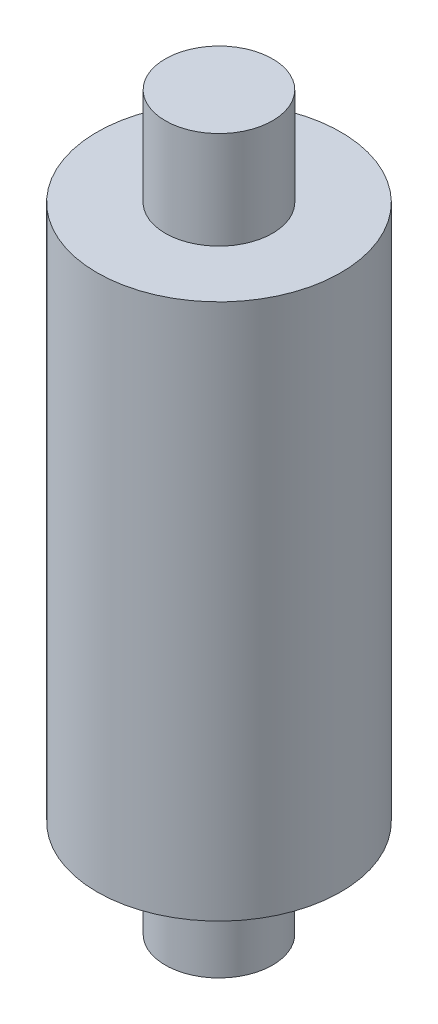
ISO-10303-21;
HEADER;
FILE_DESCRIPTION(('STEP AP214'),'2;1');
FILE_NAME('part.step','',(''),(''),'','','');
FILE_SCHEMA(('AUTOMOTIVE_DESIGN { 1 0 10303 214 1 1 1 1 }'));
ENDSEC;
DATA;
#1=APPLICATION_CONTEXT('core data for automotive mechanical design processes');
#2=APPLICATION_PROTOCOL_DEFINITION('international standard','automotive_design',2000,#1);
#3=PRODUCT_CONTEXT('',#1,'mechanical');
#4=PRODUCT('Part','Part','',(#3));
#5=PRODUCT_RELATED_PRODUCT_CATEGORY('part','',(#4));
#6=PRODUCT_DEFINITION_FORMATION('','',#4);
#7=PRODUCT_DEFINITION_CONTEXT('part definition',#1,'design');
#8=PRODUCT_DEFINITION('design','',#6,#7);
#9=PRODUCT_DEFINITION_SHAPE('','',#8);
#10=(LENGTH_UNIT() NAMED_UNIT(*) SI_UNIT(.MILLI.,.METRE.));
#11=(NAMED_UNIT(*) PLANE_ANGLE_UNIT() SI_UNIT($,.RADIAN.));
#12=(NAMED_UNIT(*) SI_UNIT($,.STERADIAN.) SOLID_ANGLE_UNIT());
#13=UNCERTAINTY_MEASURE_WITH_UNIT(LENGTH_MEASURE(1.E-05),#10,'distance_accuracy_value','');
#14=(GEOMETRIC_REPRESENTATION_CONTEXT(3) GLOBAL_UNCERTAINTY_ASSIGNED_CONTEXT((#13)) GLOBAL_UNIT_ASSIGNED_CONTEXT((#10,
#11,#12)) REPRESENTATION_CONTEXT('',''));
#15=CARTESIAN_POINT('',(0.,0.,0.));
#16=DIRECTION('',(0.,0.,1.));
#17=DIRECTION('',(1.,0.,0.));
#18=AXIS2_PLACEMENT_3D('',#15,#16,#17);
#19=CARTESIAN_POINT('',(0.,11.,0.));
#20=DIRECTION('',(0.,-1.,0.));
#21=DIRECTION('',(0.,0.,-1.));
#22=AXIS2_PLACEMENT_3D('',#19,#20,#21);
#23=CYLINDRICAL_SURFACE('',#22,2.5);
#24=CARTESIAN_POINT('',(0.,11.,0.));
#25=DIRECTION('',(0.,1.,0.));
#26=DIRECTION('',(0.,0.,1.));
#27=AXIS2_PLACEMENT_3D('',#24,#25,#26);
#28=CIRCLE('',#27,2.5);
#29=CARTESIAN_POINT('',(0.,11.,2.5));
#30=VERTEX_POINT('',#29);
#31=EDGE_CURVE('E51',#30,#30,#28,.T.);
#32=ORIENTED_EDGE('',*,*,#31,.F.);
#33=EDGE_LOOP('',(#32));
#34=FACE_BOUND('',#33,.T.);
#35=CARTESIAN_POINT('',(0.,0.,0.));
#36=DIRECTION('',(0.,1.,0.));
#37=DIRECTION('',(0.,0.,1.));
#38=AXIS2_PLACEMENT_3D('',#35,#36,#37);
#39=CIRCLE('',#38,2.5);
#40=CARTESIAN_POINT('',(0.,0.,2.5));
#41=VERTEX_POINT('',#40);
#42=EDGE_CURVE('E40',#41,#41,#39,.T.);
#43=ORIENTED_EDGE('',*,*,#42,.T.);
#44=EDGE_LOOP('',(#43));
#45=FACE_BOUND('',#44,.T.);
#46=ADVANCED_FACE('F37',(#34,#45),#23,.T.);
#47=CARTESIAN_POINT('',(0.,11.,0.));
#48=DIRECTION('',(0.,1.,0.));
#49=DIRECTION('',(0.,0.,1.));
#50=AXIS2_PLACEMENT_3D('',#47,#48,#49);
#51=PLANE('',#50);
#52=CARTESIAN_POINT('',(0.,11.,0.));
#53=DIRECTION('',(0.,1.,0.));
#54=DIRECTION('',(0.,0.,1.));
#55=AXIS2_PLACEMENT_3D('',#52,#53,#54);
#56=CIRCLE('',#55,1.1);
#57=CARTESIAN_POINT('',(0.,11.,1.1));
#58=VERTEX_POINT('',#57);
#59=EDGE_CURVE('E45',#58,#58,#56,.T.);
#60=ORIENTED_EDGE('',*,*,#59,.F.);
#61=EDGE_LOOP('',(#60));
#62=FACE_BOUND('',#61,.T.);
#63=ORIENTED_EDGE('',*,*,#31,.T.);
#64=EDGE_LOOP('',(#63));
#65=FACE_BOUND('',#64,.T.);
#66=ADVANCED_FACE('F71',(#62,#65),#51,.T.);
#67=CARTESIAN_POINT('',(0.,0.,0.));
#68=DIRECTION('',(0.,1.,0.));
#69=DIRECTION('',(0.,0.,1.));
#70=AXIS2_PLACEMENT_3D('',#67,#68,#69);
#71=PLANE('',#70);
#72=CARTESIAN_POINT('',(0.,0.,0.));
#73=DIRECTION('',(0.,-1.,0.));
#74=DIRECTION('',(0.,0.,-1.));
#75=AXIS2_PLACEMENT_3D('',#72,#73,#74);
#76=CIRCLE('',#75,1.1);
#77=CARTESIAN_POINT('',(0.,0.,-1.1));
#78=VERTEX_POINT('',#77);
#79=EDGE_CURVE('E10',#78,#78,#76,.T.);
#80=ORIENTED_EDGE('',*,*,#79,.F.);
#81=EDGE_LOOP('',(#80));
#82=FACE_BOUND('',#81,.T.);
#83=ORIENTED_EDGE('',*,*,#42,.F.);
#84=EDGE_LOOP('',(#83));
#85=FACE_BOUND('',#84,.T.);
#86=ADVANCED_FACE('F68',(#82,#85),#71,.F.);
#87=CARTESIAN_POINT('',(0.,13.,0.));
#88=DIRECTION('',(0.,-1.,0.));
#89=DIRECTION('',(0.,0.,-1.));
#90=AXIS2_PLACEMENT_3D('',#87,#88,#89);
#91=CYLINDRICAL_SURFACE('',#90,1.1);
#92=CARTESIAN_POINT('',(0.,13.,0.));
#93=DIRECTION('',(0.,1.,0.));
#94=DIRECTION('',(0.,0.,1.));
#95=AXIS2_PLACEMENT_3D('',#92,#93,#94);
#96=CIRCLE('',#95,1.1);
#97=CARTESIAN_POINT('',(0.,13.,1.1));
#98=VERTEX_POINT('',#97);
#99=EDGE_CURVE('E56',#98,#98,#96,.T.);
#100=ORIENTED_EDGE('',*,*,#99,.F.);
#101=EDGE_LOOP('',(#100));
#102=FACE_BOUND('',#101,.T.);
#103=ORIENTED_EDGE('',*,*,#59,.T.);
#104=EDGE_LOOP('',(#103));
#105=FACE_BOUND('',#104,.T.);
#106=ADVANCED_FACE('F70',(#102,#105),#91,.T.);
#107=CARTESIAN_POINT('',(0.,13.,0.));
#108=DIRECTION('',(0.,1.,0.));
#109=DIRECTION('',(0.,0.,1.));
#110=AXIS2_PLACEMENT_3D('',#107,#108,#109);
#111=PLANE('',#110);
#112=ORIENTED_EDGE('',*,*,#99,.T.);
#113=EDGE_LOOP('',(#112));
#114=FACE_BOUND('',#113,.T.);
#115=ADVANCED_FACE('F77',(#114),#111,.T.);
#116=CARTESIAN_POINT('',(0.,-2.,0.));
#117=DIRECTION('',(0.,1.,0.));
#118=DIRECTION('',(0.,0.,1.));
#119=AXIS2_PLACEMENT_3D('',#116,#117,#118);
#120=CYLINDRICAL_SURFACE('',#119,1.1);
#121=CARTESIAN_POINT('',(0.,-2.,0.));
#122=DIRECTION('',(0.,-1.,0.));
#123=DIRECTION('',(0.,0.,-1.));
#124=AXIS2_PLACEMENT_3D('',#121,#122,#123);
#125=CIRCLE('',#124,1.1);
#126=CARTESIAN_POINT('',(0.,-2.,-1.1));
#127=VERTEX_POINT('',#126);
#128=EDGE_CURVE('E55',#127,#127,#125,.T.);
#129=ORIENTED_EDGE('',*,*,#128,.F.);
#130=EDGE_LOOP('',(#129));
#131=FACE_BOUND('',#130,.T.);
#132=ORIENTED_EDGE('',*,*,#79,.T.);
#133=EDGE_LOOP('',(#132));
#134=FACE_BOUND('',#133,.T.);
#135=ADVANCED_FACE('F105',(#131,#134),#120,.T.);
#136=CARTESIAN_POINT('',(0.,-2.,0.));
#137=DIRECTION('',(0.,-1.,0.));
#138=DIRECTION('',(0.,0.,-1.));
#139=AXIS2_PLACEMENT_3D('',#136,#137,#138);
#140=PLANE('',#139);
#141=ORIENTED_EDGE('',*,*,#128,.T.);
#142=EDGE_LOOP('',(#141));
#143=FACE_BOUND('',#142,.T.);
#144=ADVANCED_FACE('F119',(#143),#140,.T.);
#145=CLOSED_SHELL('',(#46,#66,#86,#106,#115,#135,#144));
#146=MANIFOLD_SOLID_BREP('B2',#145);
#147=ADVANCED_BREP_SHAPE_REPRESENTATION('',(#18,#146),#14);
#148=SHAPE_DEFINITION_REPRESENTATION(#9,#147);
ENDSEC;
END-ISO-10303-21;
